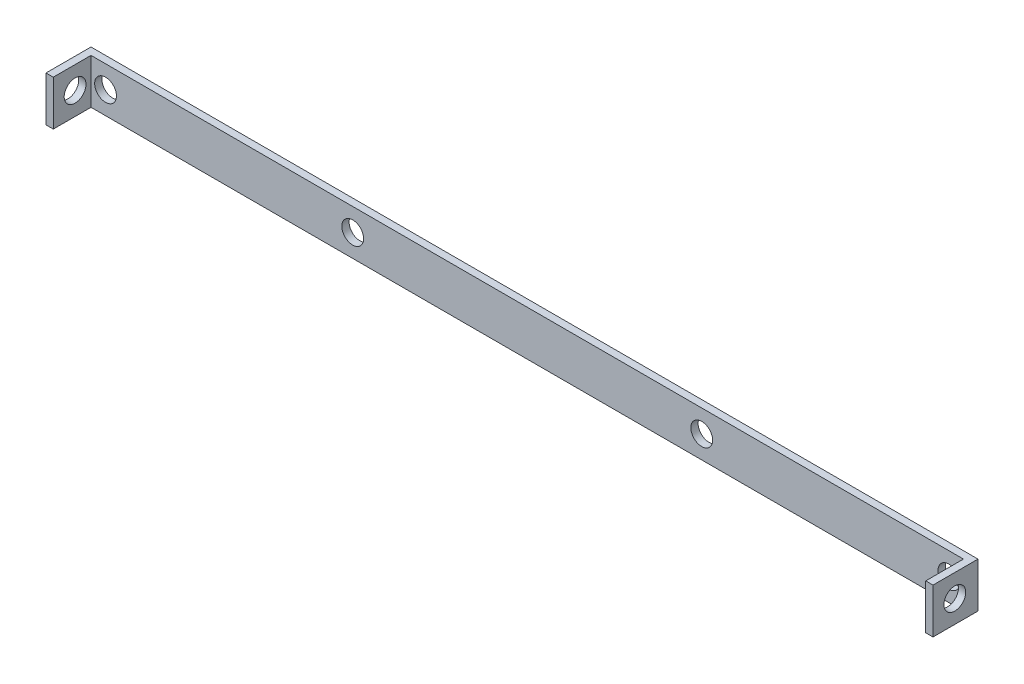
ISO-10303-21;
HEADER;
FILE_DESCRIPTION(('STEP AP214'),'2;1');
FILE_NAME('part.step','',(''),(''),'','','');
FILE_SCHEMA(('AUTOMOTIVE_DESIGN { 1 0 10303 214 1 1 1 1 }'));
ENDSEC;
DATA;
#1=APPLICATION_CONTEXT('core data for automotive mechanical design processes');
#2=APPLICATION_PROTOCOL_DEFINITION('international standard','automotive_design',2000,#1);
#3=PRODUCT_CONTEXT('',#1,'mechanical');
#4=PRODUCT('Part','Part','',(#3));
#5=PRODUCT_RELATED_PRODUCT_CATEGORY('part','',(#4));
#6=PRODUCT_DEFINITION_FORMATION('','',#4);
#7=PRODUCT_DEFINITION_CONTEXT('part definition',#1,'design');
#8=PRODUCT_DEFINITION('design','',#6,#7);
#9=PRODUCT_DEFINITION_SHAPE('','',#8);
#10=(LENGTH_UNIT() NAMED_UNIT(*) SI_UNIT(.MILLI.,.METRE.));
#11=(NAMED_UNIT(*) PLANE_ANGLE_UNIT() SI_UNIT($,.RADIAN.));
#12=(NAMED_UNIT(*) SI_UNIT($,.STERADIAN.) SOLID_ANGLE_UNIT());
#13=UNCERTAINTY_MEASURE_WITH_UNIT(LENGTH_MEASURE(1.E-05),#10,'distance_accuracy_value','');
#14=(GEOMETRIC_REPRESENTATION_CONTEXT(3) GLOBAL_UNCERTAINTY_ASSIGNED_CONTEXT((#13)) GLOBAL_UNIT_ASSIGNED_CONTEXT((#10,
#11,#12)) REPRESENTATION_CONTEXT('',''));
#15=CARTESIAN_POINT('',(0.,0.,0.));
#16=DIRECTION('',(0.,0.,1.));
#17=DIRECTION('',(1.,0.,0.));
#18=AXIS2_PLACEMENT_3D('',#15,#16,#17);
#19=CARTESIAN_POINT('',(0.,0.,4.9125));
#20=DIRECTION('',(0.,0.,-1.));
#21=DIRECTION('',(-1.,0.,0.));
#22=AXIS2_PLACEMENT_3D('',#19,#20,#21);
#23=PLANE('',#22);
#24=DIRECTION('',(0.,1.,0.));
#25=VECTOR('',#24,1.);
#26=CARTESIAN_POINT('',(47.61875,0.,4.9125));
#27=LINE('',#26,#25);
#28=CARTESIAN_POINT('',(47.61875,-2.45625,4.9125));
#29=VERTEX_POINT('',#28);
#30=CARTESIAN_POINT('',(47.61875,2.45625,4.9125));
#31=VERTEX_POINT('',#30);
#32=EDGE_CURVE('E124',#29,#31,#27,.T.);
#33=ORIENTED_EDGE('',*,*,#32,.F.);
#34=DIRECTION('',(1.,0.,0.));
#35=VECTOR('',#34,1.);
#36=CARTESIAN_POINT('',(-48.4125,-2.45625,4.9125));
#37=LINE('',#36,#35);
#38=CARTESIAN_POINT('',(48.4125,-2.45625,4.9125));
#39=VERTEX_POINT('',#38);
#40=EDGE_CURVE('E67',#29,#39,#37,.T.);
#41=ORIENTED_EDGE('',*,*,#40,.T.);
#42=DIRECTION('',(0.,1.,0.));
#43=VECTOR('',#42,1.);
#44=CARTESIAN_POINT('',(48.4125,-2.45625,4.9125));
#45=LINE('',#44,#43);
#46=CARTESIAN_POINT('',(48.4125,2.45625,4.9125));
#47=VERTEX_POINT('',#46);
#48=EDGE_CURVE('E151',#39,#47,#45,.T.);
#49=ORIENTED_EDGE('',*,*,#48,.T.);
#50=DIRECTION('',(-1.,0.,0.));
#51=VECTOR('',#50,1.);
#52=CARTESIAN_POINT('',(-48.4125,2.45625,4.9125));
#53=LINE('',#52,#51);
#54=EDGE_CURVE('E96',#47,#31,#53,.T.);
#55=ORIENTED_EDGE('',*,*,#54,.T.);
#56=EDGE_LOOP('',(#33,#41,#49,#55));
#57=FACE_BOUND('',#56,.T.);
#58=ADVANCED_FACE('F42',(#57),#23,.F.);
#59=DIRECTION('',(0.,-1.,0.));
#60=VECTOR('',#59,1.);
#61=CARTESIAN_POINT('',(-47.61875,0.,4.9125));
#62=LINE('',#61,#60);
#63=CARTESIAN_POINT('',(-47.61875,2.45625,4.9125));
#64=VERTEX_POINT('',#63);
#65=CARTESIAN_POINT('',(-47.61875,-2.45625,4.9125));
#66=VERTEX_POINT('',#65);
#67=EDGE_CURVE('E143',#64,#66,#62,.T.);
#68=ORIENTED_EDGE('',*,*,#67,.F.);
#69=CARTESIAN_POINT('',(-48.4125,2.45625,4.9125));
#70=VERTEX_POINT('',#69);
#71=EDGE_CURVE('E153',#64,#70,#53,.T.);
#72=ORIENTED_EDGE('',*,*,#71,.T.);
#73=DIRECTION('',(0.,-1.,0.));
#74=VECTOR('',#73,1.);
#75=CARTESIAN_POINT('',(-48.4125,-2.45625,4.9125));
#76=LINE('',#75,#74);
#77=CARTESIAN_POINT('',(-48.4125,-2.45625,4.9125));
#78=VERTEX_POINT('',#77);
#79=EDGE_CURVE('E155',#70,#78,#76,.T.);
#80=ORIENTED_EDGE('',*,*,#79,.T.);
#81=EDGE_CURVE('E157',#78,#66,#37,.T.);
#82=ORIENTED_EDGE('',*,*,#81,.T.);
#83=EDGE_LOOP('',(#68,#72,#80,#82));
#84=FACE_BOUND('',#83,.T.);
#85=ADVANCED_FACE('F187',(#84),#23,.F.);
#86=CARTESIAN_POINT('',(48.4125,-2.45625,4.9125));
#87=DIRECTION('',(-1.,0.,0.));
#88=DIRECTION('',(0.,0.,1.));
#89=AXIS2_PLACEMENT_3D('',#86,#87,#88);
#90=PLANE('',#89);
#91=CARTESIAN_POINT('',(48.4125,0.,2.53125));
#92=DIRECTION('',(-1.,0.,0.));
#93=DIRECTION('',(0.,0.,1.));
#94=AXIS2_PLACEMENT_3D('',#91,#92,#93);
#95=CIRCLE('',#94,1.190625);
#96=CARTESIAN_POINT('',(48.4125,0.,3.721875));
#97=VERTEX_POINT('',#96);
#98=EDGE_CURVE('E213',#97,#97,#95,.T.);
#99=ORIENTED_EDGE('',*,*,#98,.T.);
#100=EDGE_LOOP('',(#99));
#101=FACE_BOUND('',#100,.T.);
#102=DIRECTION('',(0.,1.,0.));
#103=VECTOR('',#102,1.);
#104=CARTESIAN_POINT('',(48.4125,-2.45625,0.));
#105=LINE('',#104,#103);
#106=CARTESIAN_POINT('',(48.4125,-2.45625,0.));
#107=VERTEX_POINT('',#106);
#108=CARTESIAN_POINT('',(48.4125,2.45625,0.));
#109=VERTEX_POINT('',#108);
#110=EDGE_CURVE('E126',#107,#109,#105,.T.);
#111=ORIENTED_EDGE('',*,*,#110,.T.);
#112=DIRECTION('',(0.,0.,-1.));
#113=VECTOR('',#112,1.);
#114=CARTESIAN_POINT('',(48.4125,2.45625,4.9125));
#115=LINE('',#114,#113);
#116=EDGE_CURVE('E11',#47,#109,#115,.T.);
#117=ORIENTED_EDGE('',*,*,#116,.F.);
#118=ORIENTED_EDGE('',*,*,#48,.F.);
#119=DIRECTION('',(0.,0.,-1.));
#120=VECTOR('',#119,1.);
#121=CARTESIAN_POINT('',(48.4125,-2.45625,4.9125));
#122=LINE('',#121,#120);
#123=EDGE_CURVE('E160',#39,#107,#122,.T.);
#124=ORIENTED_EDGE('',*,*,#123,.T.);
#125=EDGE_LOOP('',(#111,#117,#118,#124));
#126=FACE_BOUND('',#125,.T.);
#127=ADVANCED_FACE('F44',(#101,#126),#90,.F.);
#128=CARTESIAN_POINT('',(-48.4125,2.45625,4.9125));
#129=DIRECTION('',(0.,-1.,0.));
#130=DIRECTION('',(0.,0.,-1.));
#131=AXIS2_PLACEMENT_3D('',#128,#129,#130);
#132=PLANE('',#131);
#133=ORIENTED_EDGE('',*,*,#71,.F.);
#134=DIRECTION('',(0.,0.,-1.));
#135=VECTOR('',#134,1.);
#136=CARTESIAN_POINT('',(-47.61875,2.45625,4.9125));
#137=LINE('',#136,#135);
#138=CARTESIAN_POINT('',(-47.61875,2.45625,0.79375));
#139=VERTEX_POINT('',#138);
#140=EDGE_CURVE('E58',#64,#139,#137,.T.);
#141=ORIENTED_EDGE('',*,*,#140,.T.);
#142=DIRECTION('',(-1.,0.,0.));
#143=VECTOR('',#142,1.);
#144=CARTESIAN_POINT('',(0.,2.45625,0.79375));
#145=LINE('',#144,#143);
#146=CARTESIAN_POINT('',(47.61875,2.45625,0.79375));
#147=VERTEX_POINT('',#146);
#148=EDGE_CURVE('E130',#147,#139,#145,.T.);
#149=ORIENTED_EDGE('',*,*,#148,.F.);
#150=DIRECTION('',(0.,0.,-1.));
#151=VECTOR('',#150,1.);
#152=CARTESIAN_POINT('',(47.61875,2.45625,4.9125));
#153=LINE('',#152,#151);
#154=EDGE_CURVE('E119',#31,#147,#153,.T.);
#155=ORIENTED_EDGE('',*,*,#154,.F.);
#156=ORIENTED_EDGE('',*,*,#54,.F.);
#157=ORIENTED_EDGE('',*,*,#116,.T.);
#158=DIRECTION('',(-1.,0.,0.));
#159=VECTOR('',#158,1.);
#160=CARTESIAN_POINT('',(-48.4125,2.45625,0.));
#161=LINE('',#160,#159);
#162=CARTESIAN_POINT('',(-48.4125,2.45625,0.));
#163=VERTEX_POINT('',#162);
#164=EDGE_CURVE('E163',#109,#163,#161,.T.);
#165=ORIENTED_EDGE('',*,*,#164,.T.);
#166=DIRECTION('',(0.,0.,-1.));
#167=VECTOR('',#166,1.);
#168=CARTESIAN_POINT('',(-48.4125,2.45625,4.9125));
#169=LINE('',#168,#167);
#170=EDGE_CURVE('E51',#70,#163,#169,.T.);
#171=ORIENTED_EDGE('',*,*,#170,.F.);
#172=EDGE_LOOP('',(#133,#141,#149,#155,#156,#157,#165,#171));
#173=FACE_BOUND('',#172,.T.);
#174=ADVANCED_FACE('F136',(#173),#132,.F.);
#175=CARTESIAN_POINT('',(-48.4125,-2.45625,4.9125));
#176=DIRECTION('',(1.,0.,0.));
#177=DIRECTION('',(0.,0.,-1.));
#178=AXIS2_PLACEMENT_3D('',#175,#176,#177);
#179=PLANE('',#178);
#180=CARTESIAN_POINT('',(-48.4125,0.,2.53125));
#181=DIRECTION('',(-1.,0.,0.));
#182=DIRECTION('',(0.,0.,1.));
#183=AXIS2_PLACEMENT_3D('',#180,#181,#182);
#184=CIRCLE('',#183,1.190625);
#185=CARTESIAN_POINT('',(-48.4125,0.,3.721875));
#186=VERTEX_POINT('',#185);
#187=EDGE_CURVE('E215',#186,#186,#184,.T.);
#188=ORIENTED_EDGE('',*,*,#187,.F.);
#189=EDGE_LOOP('',(#188));
#190=FACE_BOUND('',#189,.T.);
#191=DIRECTION('',(0.,-1.,0.));
#192=VECTOR('',#191,1.);
#193=CARTESIAN_POINT('',(-48.4125,-2.45625,0.));
#194=LINE('',#193,#192);
#195=CARTESIAN_POINT('',(-48.4125,-2.45625,0.));
#196=VERTEX_POINT('',#195);
#197=EDGE_CURVE('E165',#163,#196,#194,.T.);
#198=ORIENTED_EDGE('',*,*,#197,.T.);
#199=DIRECTION('',(0.,0.,-1.));
#200=VECTOR('',#199,1.);
#201=CARTESIAN_POINT('',(-48.4125,-2.45625,4.9125));
#202=LINE('',#201,#200);
#203=EDGE_CURVE('E169',#78,#196,#202,.T.);
#204=ORIENTED_EDGE('',*,*,#203,.F.);
#205=ORIENTED_EDGE('',*,*,#79,.F.);
#206=ORIENTED_EDGE('',*,*,#170,.T.);
#207=EDGE_LOOP('',(#198,#204,#205,#206));
#208=FACE_BOUND('',#207,.T.);
#209=ADVANCED_FACE('F176',(#190,#208),#179,.F.);
#210=CARTESIAN_POINT('',(-48.4125,-2.45625,4.9125));
#211=DIRECTION('',(0.,1.,0.));
#212=DIRECTION('',(0.,0.,1.));
#213=AXIS2_PLACEMENT_3D('',#210,#211,#212);
#214=PLANE('',#213);
#215=ORIENTED_EDGE('',*,*,#40,.F.);
#216=DIRECTION('',(0.,0.,-1.));
#217=VECTOR('',#216,1.);
#218=CARTESIAN_POINT('',(47.61875,-2.45625,4.9125));
#219=LINE('',#218,#217);
#220=CARTESIAN_POINT('',(47.61875,-2.45625,0.79375));
#221=VERTEX_POINT('',#220);
#222=EDGE_CURVE('E145',#29,#221,#219,.T.);
#223=ORIENTED_EDGE('',*,*,#222,.T.);
#224=DIRECTION('',(1.,0.,0.));
#225=VECTOR('',#224,1.);
#226=CARTESIAN_POINT('',(0.,-2.45625,0.79375));
#227=LINE('',#226,#225);
#228=CARTESIAN_POINT('',(-47.61875,-2.45625,0.79375));
#229=VERTEX_POINT('',#228);
#230=EDGE_CURVE('E132',#229,#221,#227,.T.);
#231=ORIENTED_EDGE('',*,*,#230,.F.);
#232=DIRECTION('',(0.,0.,-1.));
#233=VECTOR('',#232,1.);
#234=CARTESIAN_POINT('',(-47.61875,-2.45625,4.9125));
#235=LINE('',#234,#233);
#236=EDGE_CURVE('E142',#66,#229,#235,.T.);
#237=ORIENTED_EDGE('',*,*,#236,.F.);
#238=ORIENTED_EDGE('',*,*,#81,.F.);
#239=ORIENTED_EDGE('',*,*,#203,.T.);
#240=DIRECTION('',(1.,0.,0.));
#241=VECTOR('',#240,1.);
#242=CARTESIAN_POINT('',(-48.4125,-2.45625,0.));
#243=LINE('',#242,#241);
#244=EDGE_CURVE('E89',#196,#107,#243,.T.);
#245=ORIENTED_EDGE('',*,*,#244,.T.);
#246=ORIENTED_EDGE('',*,*,#123,.F.);
#247=EDGE_LOOP('',(#215,#223,#231,#237,#238,#239,#245,#246));
#248=FACE_BOUND('',#247,.T.);
#249=ADVANCED_FACE('F184',(#248),#214,.F.);
#250=CARTESIAN_POINT('',(0.,0.,0.));
#251=DIRECTION('',(0.,0.,-1.));
#252=DIRECTION('',(-1.,0.,0.));
#253=AXIS2_PLACEMENT_3D('',#250,#251,#252);
#254=PLANE('',#253);
#255=CARTESIAN_POINT('',(-46.03125,0.,0.));
#256=DIRECTION('',(0.,0.,1.));
#257=DIRECTION('',(1.,0.,0.));
#258=AXIS2_PLACEMENT_3D('',#255,#256,#257);
#259=CIRCLE('',#258,1.190625);
#260=CARTESIAN_POINT('',(-44.840625,0.,0.));
#261=VERTEX_POINT('',#260);
#262=EDGE_CURVE('E133',#261,#261,#259,.T.);
#263=ORIENTED_EDGE('',*,*,#262,.T.);
#264=EDGE_LOOP('',(#263));
#265=FACE_BOUND('',#264,.T.);
#266=CARTESIAN_POINT('',(-19.05,0.,0.));
#267=DIRECTION('',(0.,0.,1.));
#268=DIRECTION('',(1.,0.,0.));
#269=AXIS2_PLACEMENT_3D('',#266,#267,#268);
#270=CIRCLE('',#269,1.190625);
#271=CARTESIAN_POINT('',(-17.859375,0.,0.));
#272=VERTEX_POINT('',#271);
#273=EDGE_CURVE('E233',#272,#272,#270,.T.);
#274=ORIENTED_EDGE('',*,*,#273,.T.);
#275=EDGE_LOOP('',(#274));
#276=FACE_BOUND('',#275,.T.);
#277=CARTESIAN_POINT('',(19.05,0.,0.));
#278=DIRECTION('',(0.,0.,1.));
#279=DIRECTION('',(1.,0.,0.));
#280=AXIS2_PLACEMENT_3D('',#277,#278,#279);
#281=CIRCLE('',#280,1.190625);
#282=CARTESIAN_POINT('',(20.240625,0.,0.));
#283=VERTEX_POINT('',#282);
#284=EDGE_CURVE('E239',#283,#283,#281,.T.);
#285=ORIENTED_EDGE('',*,*,#284,.T.);
#286=EDGE_LOOP('',(#285));
#287=FACE_BOUND('',#286,.T.);
#288=CARTESIAN_POINT('',(46.03125,0.,0.));
#289=DIRECTION('',(0.,0.,1.));
#290=DIRECTION('',(1.,0.,0.));
#291=AXIS2_PLACEMENT_3D('',#288,#289,#290);
#292=CIRCLE('',#291,1.190625);
#293=CARTESIAN_POINT('',(47.221875,0.,0.));
#294=VERTEX_POINT('',#293);
#295=EDGE_CURVE('E224',#294,#294,#292,.T.);
#296=ORIENTED_EDGE('',*,*,#295,.T.);
#297=EDGE_LOOP('',(#296));
#298=FACE_BOUND('',#297,.T.);
#299=ORIENTED_EDGE('',*,*,#110,.F.);
#300=ORIENTED_EDGE('',*,*,#244,.F.);
#301=ORIENTED_EDGE('',*,*,#197,.F.);
#302=ORIENTED_EDGE('',*,*,#164,.F.);
#303=EDGE_LOOP('',(#299,#300,#301,#302));
#304=FACE_BOUND('',#303,.T.);
#305=ADVANCED_FACE('F180',(#265,#276,#287,#298,#304),#254,.T.);
#306=CARTESIAN_POINT('',(47.61875,-2.45625,4.9125));
#307=DIRECTION('',(-1.,0.,0.));
#308=DIRECTION('',(0.,0.,1.));
#309=AXIS2_PLACEMENT_3D('',#306,#307,#308);
#310=PLANE('',#309);
#311=CARTESIAN_POINT('',(47.61875,0.,2.53125));
#312=DIRECTION('',(-1.,0.,0.));
#313=DIRECTION('',(0.,0.,1.));
#314=AXIS2_PLACEMENT_3D('',#311,#312,#313);
#315=CIRCLE('',#314,1.190625);
#316=CARTESIAN_POINT('',(47.61875,0.,3.721875));
#317=VERTEX_POINT('',#316);
#318=EDGE_CURVE('E218',#317,#317,#315,.T.);
#319=ORIENTED_EDGE('',*,*,#318,.F.);
#320=EDGE_LOOP('',(#319));
#321=FACE_BOUND('',#320,.T.);
#322=DIRECTION('',(0.,1.,0.));
#323=VECTOR('',#322,1.);
#324=CARTESIAN_POINT('',(47.61875,0.,0.79375));
#325=LINE('',#324,#323);
#326=EDGE_CURVE('E122',#221,#147,#325,.T.);
#327=ORIENTED_EDGE('',*,*,#326,.F.);
#328=ORIENTED_EDGE('',*,*,#222,.F.);
#329=ORIENTED_EDGE('',*,*,#32,.T.);
#330=ORIENTED_EDGE('',*,*,#154,.T.);
#331=EDGE_LOOP('',(#327,#328,#329,#330));
#332=FACE_BOUND('',#331,.T.);
#333=ADVANCED_FACE('F121',(#321,#332),#310,.T.);
#334=CARTESIAN_POINT('',(-47.61875,-2.45625,4.9125));
#335=DIRECTION('',(1.,0.,0.));
#336=DIRECTION('',(0.,0.,-1.));
#337=AXIS2_PLACEMENT_3D('',#334,#335,#336);
#338=PLANE('',#337);
#339=CARTESIAN_POINT('',(-47.61875,0.,2.53125));
#340=DIRECTION('',(1.,0.,0.));
#341=DIRECTION('',(0.,0.,-1.));
#342=AXIS2_PLACEMENT_3D('',#339,#340,#341);
#343=CIRCLE('',#342,1.190625);
#344=CARTESIAN_POINT('',(-47.61875,0.,3.721875));
#345=VERTEX_POINT('',#344);
#346=EDGE_CURVE('E46',#345,#345,#343,.T.);
#347=ORIENTED_EDGE('',*,*,#346,.F.);
#348=EDGE_LOOP('',(#347));
#349=FACE_BOUND('',#348,.T.);
#350=DIRECTION('',(0.,-1.,0.));
#351=VECTOR('',#350,1.);
#352=CARTESIAN_POINT('',(-47.61875,0.,0.79375));
#353=LINE('',#352,#351);
#354=EDGE_CURVE('E137',#139,#229,#353,.T.);
#355=ORIENTED_EDGE('',*,*,#354,.F.);
#356=ORIENTED_EDGE('',*,*,#140,.F.);
#357=ORIENTED_EDGE('',*,*,#67,.T.);
#358=ORIENTED_EDGE('',*,*,#236,.T.);
#359=EDGE_LOOP('',(#355,#356,#357,#358));
#360=FACE_BOUND('',#359,.T.);
#361=ADVANCED_FACE('F257',(#349,#360),#338,.T.);
#362=CARTESIAN_POINT('',(0.,0.,0.79375));
#363=DIRECTION('',(0.,0.,-1.));
#364=DIRECTION('',(-1.,0.,0.));
#365=AXIS2_PLACEMENT_3D('',#362,#363,#364);
#366=PLANE('',#365);
#367=CARTESIAN_POINT('',(-46.03125,0.,0.79375));
#368=DIRECTION('',(0.,0.,1.));
#369=DIRECTION('',(1.,0.,0.));
#370=AXIS2_PLACEMENT_3D('',#367,#368,#369);
#371=CIRCLE('',#370,1.190625);
#372=CARTESIAN_POINT('',(-44.840625,0.,0.79375));
#373=VERTEX_POINT('',#372);
#374=EDGE_CURVE('E227',#373,#373,#371,.T.);
#375=ORIENTED_EDGE('',*,*,#374,.F.);
#376=EDGE_LOOP('',(#375));
#377=FACE_BOUND('',#376,.T.);
#378=CARTESIAN_POINT('',(-19.05,0.,0.79375));
#379=DIRECTION('',(0.,0.,1.));
#380=DIRECTION('',(1.,0.,0.));
#381=AXIS2_PLACEMENT_3D('',#378,#379,#380);
#382=CIRCLE('',#381,1.190625);
#383=CARTESIAN_POINT('',(-17.859375,0.,0.79375));
#384=VERTEX_POINT('',#383);
#385=EDGE_CURVE('E230',#384,#384,#382,.T.);
#386=ORIENTED_EDGE('',*,*,#385,.F.);
#387=EDGE_LOOP('',(#386));
#388=FACE_BOUND('',#387,.T.);
#389=CARTESIAN_POINT('',(19.05,0.,0.79375));
#390=DIRECTION('',(0.,0.,1.));
#391=DIRECTION('',(1.,0.,0.));
#392=AXIS2_PLACEMENT_3D('',#389,#390,#391);
#393=CIRCLE('',#392,1.190625);
#394=CARTESIAN_POINT('',(20.240625,0.,0.79375));
#395=VERTEX_POINT('',#394);
#396=EDGE_CURVE('E236',#395,#395,#393,.T.);
#397=ORIENTED_EDGE('',*,*,#396,.F.);
#398=EDGE_LOOP('',(#397));
#399=FACE_BOUND('',#398,.T.);
#400=CARTESIAN_POINT('',(46.03125,0.,0.79375));
#401=DIRECTION('',(0.,0.,1.));
#402=DIRECTION('',(1.,0.,0.));
#403=AXIS2_PLACEMENT_3D('',#400,#401,#402);
#404=CIRCLE('',#403,1.190625);
#405=CARTESIAN_POINT('',(47.221875,0.,0.79375));
#406=VERTEX_POINT('',#405);
#407=EDGE_CURVE('E242',#406,#406,#404,.T.);
#408=ORIENTED_EDGE('',*,*,#407,.F.);
#409=EDGE_LOOP('',(#408));
#410=FACE_BOUND('',#409,.T.);
#411=ORIENTED_EDGE('',*,*,#326,.T.);
#412=ORIENTED_EDGE('',*,*,#148,.T.);
#413=ORIENTED_EDGE('',*,*,#354,.T.);
#414=ORIENTED_EDGE('',*,*,#230,.T.);
#415=EDGE_LOOP('',(#411,#412,#413,#414));
#416=FACE_BOUND('',#415,.T.);
#417=ADVANCED_FACE('F129',(#377,#388,#399,#410,#416),#366,.F.);
#418=CARTESIAN_POINT('',(46.03125,0.,0.));
#419=DIRECTION('',(0.,0.,1.));
#420=DIRECTION('',(1.,0.,0.));
#421=AXIS2_PLACEMENT_3D('',#418,#419,#420);
#422=CYLINDRICAL_SURFACE('',#421,1.190625);
#423=ORIENTED_EDGE('',*,*,#295,.F.);
#424=EDGE_LOOP('',(#423));
#425=FACE_BOUND('',#424,.T.);
#426=ORIENTED_EDGE('',*,*,#407,.T.);
#427=EDGE_LOOP('',(#426));
#428=FACE_BOUND('',#427,.T.);
#429=ADVANCED_FACE('F249',(#425,#428),#422,.F.);
#430=CARTESIAN_POINT('',(19.05,0.,0.));
#431=DIRECTION('',(0.,0.,1.));
#432=DIRECTION('',(1.,0.,0.));
#433=AXIS2_PLACEMENT_3D('',#430,#431,#432);
#434=CYLINDRICAL_SURFACE('',#433,1.190625);
#435=ORIENTED_EDGE('',*,*,#284,.F.);
#436=EDGE_LOOP('',(#435));
#437=FACE_BOUND('',#436,.T.);
#438=ORIENTED_EDGE('',*,*,#396,.T.);
#439=EDGE_LOOP('',(#438));
#440=FACE_BOUND('',#439,.T.);
#441=ADVANCED_FACE('F252',(#437,#440),#434,.F.);
#442=CARTESIAN_POINT('',(-19.05,0.,0.));
#443=DIRECTION('',(0.,0.,1.));
#444=DIRECTION('',(1.,0.,0.));
#445=AXIS2_PLACEMENT_3D('',#442,#443,#444);
#446=CYLINDRICAL_SURFACE('',#445,1.190625);
#447=ORIENTED_EDGE('',*,*,#273,.F.);
#448=EDGE_LOOP('',(#447));
#449=FACE_BOUND('',#448,.T.);
#450=ORIENTED_EDGE('',*,*,#385,.T.);
#451=EDGE_LOOP('',(#450));
#452=FACE_BOUND('',#451,.T.);
#453=ADVANCED_FACE('F270',(#449,#452),#446,.F.);
#454=CARTESIAN_POINT('',(-46.03125,0.,0.));
#455=DIRECTION('',(0.,0.,1.));
#456=DIRECTION('',(1.,0.,0.));
#457=AXIS2_PLACEMENT_3D('',#454,#455,#456);
#458=CYLINDRICAL_SURFACE('',#457,1.190625);
#459=ORIENTED_EDGE('',*,*,#262,.F.);
#460=EDGE_LOOP('',(#459));
#461=FACE_BOUND('',#460,.T.);
#462=ORIENTED_EDGE('',*,*,#374,.T.);
#463=EDGE_LOOP('',(#462));
#464=FACE_BOUND('',#463,.T.);
#465=ADVANCED_FACE('F276',(#461,#464),#458,.F.);
#466=CARTESIAN_POINT('',(48.4125,0.,2.53125));
#467=DIRECTION('',(-1.,0.,0.));
#468=DIRECTION('',(0.,0.,1.));
#469=AXIS2_PLACEMENT_3D('',#466,#467,#468);
#470=CYLINDRICAL_SURFACE('',#469,1.190625);
#471=CARTESIAN_POINT('',(-47.61875,0.,3.721875));
#472=CARTESIAN_POINT('',(-47.6270182291667,0.,3.721875));
#473=CARTESIAN_POINT('',(-47.6352864583333,0.,3.721875));
#474=CARTESIAN_POINT('',(-47.6518229166667,0.,3.721875));
#475=CARTESIAN_POINT('',(-47.6600911458333,0.,3.721875));
#476=CARTESIAN_POINT('',(-47.6766276041667,0.,3.721875));
#477=CARTESIAN_POINT('',(-47.6848958333333,0.,3.721875));
#478=CARTESIAN_POINT('',(-47.7014322916666,0.,3.721875));
#479=CARTESIAN_POINT('',(-47.7097005208333,0.,3.721875));
#480=CARTESIAN_POINT('',(-47.7262369791667,0.,3.721875));
#481=CARTESIAN_POINT('',(-47.7345052083333,0.,3.721875));
#482=CARTESIAN_POINT('',(-47.7510416666667,0.,3.721875));
#483=CARTESIAN_POINT('',(-47.7593098958333,0.,3.721875));
#484=CARTESIAN_POINT('',(-47.7758463541667,0.,3.721875));
#485=CARTESIAN_POINT('',(-47.7841145833333,0.,3.721875));
#486=CARTESIAN_POINT('',(-47.8006510416666,0.,3.721875));
#487=CARTESIAN_POINT('',(-47.8089192708333,0.,3.721875));
#488=CARTESIAN_POINT('',(-47.8254557291667,0.,3.721875));
#489=CARTESIAN_POINT('',(-47.8337239583333,0.,3.721875));
#490=CARTESIAN_POINT('',(-47.8502604166667,0.,3.721875));
#491=CARTESIAN_POINT('',(-47.8585286458333,0.,3.721875));
#492=CARTESIAN_POINT('',(-47.8750651041667,0.,3.721875));
#493=CARTESIAN_POINT('',(-47.8833333333333,0.,3.721875));
#494=CARTESIAN_POINT('',(-47.8998697916667,0.,3.721875));
#495=CARTESIAN_POINT('',(-47.9081380208333,0.,3.721875));
#496=CARTESIAN_POINT('',(-47.9246744791667,0.,3.721875));
#497=CARTESIAN_POINT('',(-47.9329427083333,0.,3.721875));
#498=CARTESIAN_POINT('',(-47.9494791666666,0.,3.721875));
#499=CARTESIAN_POINT('',(-47.9577473958333,0.,3.721875));
#500=CARTESIAN_POINT('',(-47.9742838541667,0.,3.721875));
#501=CARTESIAN_POINT('',(-47.9825520833333,0.,3.721875));
#502=CARTESIAN_POINT('',(-47.9990885416666,0.,3.721875));
#503=CARTESIAN_POINT('',(-48.0073567708333,0.,3.721875));
#504=CARTESIAN_POINT('',(-48.0238932291666,0.,3.721875));
#505=CARTESIAN_POINT('',(-48.0321614583333,0.,3.721875));
#506=CARTESIAN_POINT('',(-48.0486979166666,0.,3.721875));
#507=CARTESIAN_POINT('',(-48.0569661458333,0.,3.721875));
#508=CARTESIAN_POINT('',(-48.0735026041666,0.,3.721875));
#509=CARTESIAN_POINT('',(-48.0817708333333,0.,3.721875));
#510=CARTESIAN_POINT('',(-48.0983072916666,0.,3.721875));
#511=CARTESIAN_POINT('',(-48.1065755208333,0.,3.721875));
#512=CARTESIAN_POINT('',(-48.1231119791666,0.,3.721875));
#513=CARTESIAN_POINT('',(-48.1313802083333,0.,3.721875));
#514=CARTESIAN_POINT('',(-48.1479166666666,0.,3.721875));
#515=CARTESIAN_POINT('',(-48.1561848958333,0.,3.721875));
#516=CARTESIAN_POINT('',(-48.1727213541666,0.,3.721875));
#517=CARTESIAN_POINT('',(-48.1809895833333,0.,3.721875));
#518=CARTESIAN_POINT('',(-48.1975260416666,0.,3.721875));
#519=CARTESIAN_POINT('',(-48.2057942708333,0.,3.721875));
#520=CARTESIAN_POINT('',(-48.2223307291666,0.,3.721875));
#521=CARTESIAN_POINT('',(-48.2305989583333,0.,3.721875));
#522=CARTESIAN_POINT('',(-48.2471354166666,0.,3.721875));
#523=CARTESIAN_POINT('',(-48.2554036458333,0.,3.721875));
#524=CARTESIAN_POINT('',(-48.2719401041666,0.,3.721875));
#525=CARTESIAN_POINT('',(-48.2802083333333,0.,3.721875));
#526=CARTESIAN_POINT('',(-48.2967447916666,0.,3.721875));
#527=CARTESIAN_POINT('',(-48.3050130208333,0.,3.721875));
#528=CARTESIAN_POINT('',(-48.3215494791666,0.,3.721875));
#529=CARTESIAN_POINT('',(-48.3298177083333,0.,3.721875));
#530=CARTESIAN_POINT('',(-48.3463541666666,0.,3.721875));
#531=CARTESIAN_POINT('',(-48.3546223958333,0.,3.721875));
#532=CARTESIAN_POINT('',(-48.3711588541666,0.,3.721875));
#533=CARTESIAN_POINT('',(-48.3794270833333,0.,3.721875));
#534=CARTESIAN_POINT('',(-48.3959635416666,0.,3.721875));
#535=CARTESIAN_POINT('',(-48.4042317708333,0.,3.721875));
#536=CARTESIAN_POINT('',(-48.4125,0.,3.721875));
#537=B_SPLINE_CURVE_WITH_KNOTS('',3,(#471,#472,#473,#474,#475,#476,#477,#478,#479,#480,#481,
#482,#483,#484,#485,#486,#487,#488,#489,#490,#491,#492,#493,#494,#495,#496,#497,#498,#499,#500,
#501,#502,#503,#504,#505,#506,#507,#508,#509,#510,#511,#512,#513,#514,#515,#516,#517,#518,#519,
#520,#521,#522,#523,#524,#525,#526,#527,#528,#529,#530,#531,#532,#533,#534,#535,#536),
.UNSPECIFIED.,.F.,.F.,(4,2,2,2,2,2,2,2,2,2,2,2,2,2,2,2,2,2,2,2,2,2,2,2,2,2,2,2,2,2,2,2,4),(0.,
0.0248046875000046,0.0496093749999954,0.0744140625,0.0992187499999908,0.124023437499995,
0.148828125,0.173632812499991,0.198437499999995,0.2232421875,0.248046874999991,
0.272851562499996,0.29765625,0.322460937499991,0.347265624999996,0.372070312499986,
0.396874999999991,0.421679687499996,0.446484374999986,0.471289062499991,0.496093749999982,
0.520898437499986,0.545703124999991,0.570507812499982,0.595312499999986,0.620117187499991,
0.644921874999982,0.669726562499987,0.694531249999991,0.719335937499982,0.744140624999987,
0.768945312499977,0.793749999999982),.UNSPECIFIED.);
#538=EDGE_CURVE('BSEAM290',#345,#186,#537,.T.);
#539=ORIENTED_EDGE('',*,*,#346,.T.);
#540=ORIENTED_EDGE('',*,*,#187,.T.);
#541=ORIENTED_EDGE('',*,*,#538,.T.);
#542=ORIENTED_EDGE('',*,*,#538,.F.);
#543=EDGE_LOOP('',(#539,#541,#540,#542));
#544=FACE_BOUND('',#543,.T.);
#545=ADVANCED_FACE('F290',(#544),#470,.F.);
#546=CARTESIAN_POINT('',(47.61875,0.,3.721875));
#547=CARTESIAN_POINT('',(47.6270182291667,0.,3.721875));
#548=CARTESIAN_POINT('',(47.6352864583333,0.,3.721875));
#549=CARTESIAN_POINT('',(47.6518229166667,0.,3.721875));
#550=CARTESIAN_POINT('',(47.6600911458333,0.,3.721875));
#551=CARTESIAN_POINT('',(47.6766276041667,0.,3.721875));
#552=CARTESIAN_POINT('',(47.6848958333333,0.,3.721875));
#553=CARTESIAN_POINT('',(47.7014322916667,0.,3.721875));
#554=CARTESIAN_POINT('',(47.7097005208334,0.,3.721875));
#555=CARTESIAN_POINT('',(47.7262369791667,0.,3.721875));
#556=CARTESIAN_POINT('',(47.7345052083333,0.,3.721875));
#557=CARTESIAN_POINT('',(47.7510416666667,0.,3.721875));
#558=CARTESIAN_POINT('',(47.7593098958333,0.,3.721875));
#559=CARTESIAN_POINT('',(47.7758463541667,0.,3.721875));
#560=CARTESIAN_POINT('',(47.7841145833333,0.,3.721875));
#561=CARTESIAN_POINT('',(47.8006510416667,0.,3.721875));
#562=CARTESIAN_POINT('',(47.8089192708333,0.,3.721875));
#563=CARTESIAN_POINT('',(47.8254557291667,0.,3.721875));
#564=CARTESIAN_POINT('',(47.8337239583333,0.,3.721875));
#565=CARTESIAN_POINT('',(47.8502604166667,0.,3.721875));
#566=CARTESIAN_POINT('',(47.8585286458334,0.,3.721875));
#567=CARTESIAN_POINT('',(47.8750651041667,0.,3.721875));
#568=CARTESIAN_POINT('',(47.8833333333333,0.,3.721875));
#569=CARTESIAN_POINT('',(47.8998697916667,0.,3.721875));
#570=CARTESIAN_POINT('',(47.9081380208333,0.,3.721875));
#571=CARTESIAN_POINT('',(47.9246744791667,0.,3.721875));
#572=CARTESIAN_POINT('',(47.9329427083333,0.,3.721875));
#573=CARTESIAN_POINT('',(47.9494791666667,0.,3.721875));
#574=CARTESIAN_POINT('',(47.9577473958333,0.,3.721875));
#575=CARTESIAN_POINT('',(47.9742838541667,0.,3.721875));
#576=CARTESIAN_POINT('',(47.9825520833333,0.,3.721875));
#577=CARTESIAN_POINT('',(47.9990885416667,0.,3.721875));
#578=CARTESIAN_POINT('',(48.0073567708333,0.,3.721875));
#579=CARTESIAN_POINT('',(48.0238932291667,0.,3.721875));
#580=CARTESIAN_POINT('',(48.0321614583333,0.,3.721875));
#581=CARTESIAN_POINT('',(48.0486979166667,0.,3.721875));
#582=CARTESIAN_POINT('',(48.0569661458333,0.,3.721875));
#583=CARTESIAN_POINT('',(48.0735026041667,0.,3.721875));
#584=CARTESIAN_POINT('',(48.0817708333334,0.,3.721875));
#585=CARTESIAN_POINT('',(48.0983072916667,0.,3.721875));
#586=CARTESIAN_POINT('',(48.1065755208333,0.,3.721875));
#587=CARTESIAN_POINT('',(48.1231119791667,0.,3.721875));
#588=CARTESIAN_POINT('',(48.1313802083333,0.,3.721875));
#589=CARTESIAN_POINT('',(48.1479166666667,0.,3.721875));
#590=CARTESIAN_POINT('',(48.1561848958333,0.,3.721875));
#591=CARTESIAN_POINT('',(48.1727213541667,0.,3.721875));
#592=CARTESIAN_POINT('',(48.1809895833333,0.,3.721875));
#593=CARTESIAN_POINT('',(48.1975260416667,0.,3.721875));
#594=CARTESIAN_POINT('',(48.2057942708333,0.,3.721875));
#595=CARTESIAN_POINT('',(48.2223307291667,0.,3.721875));
#596=CARTESIAN_POINT('',(48.2305989583334,0.,3.721875));
#597=CARTESIAN_POINT('',(48.2471354166667,0.,3.721875));
#598=CARTESIAN_POINT('',(48.2554036458333,0.,3.721875));
#599=CARTESIAN_POINT('',(48.2719401041667,0.,3.721875));
#600=CARTESIAN_POINT('',(48.2802083333333,0.,3.721875));
#601=CARTESIAN_POINT('',(48.2967447916667,0.,3.721875));
#602=CARTESIAN_POINT('',(48.3050130208333,0.,3.721875));
#603=CARTESIAN_POINT('',(48.3215494791667,0.,3.721875));
#604=CARTESIAN_POINT('',(48.3298177083333,0.,3.721875));
#605=CARTESIAN_POINT('',(48.3463541666667,0.,3.721875));
#606=CARTESIAN_POINT('',(48.3546223958333,0.,3.721875));
#607=CARTESIAN_POINT('',(48.3711588541667,0.,3.721875));
#608=CARTESIAN_POINT('',(48.3794270833333,0.,3.721875));
#609=CARTESIAN_POINT('',(48.3959635416667,0.,3.721875));
#610=CARTESIAN_POINT('',(48.4042317708333,0.,3.721875));
#611=CARTESIAN_POINT('',(48.4125,0.,3.721875));
#612=B_SPLINE_CURVE_WITH_KNOTS('',3,(#546,#547,#548,#549,#550,#551,#552,#553,#554,#555,#556,
#557,#558,#559,#560,#561,#562,#563,#564,#565,#566,#567,#568,#569,#570,#571,#572,#573,#574,#575,
#576,#577,#578,#579,#580,#581,#582,#583,#584,#585,#586,#587,#588,#589,#590,#591,#592,#593,#594,
#595,#596,#597,#598,#599,#600,#601,#602,#603,#604,#605,#606,#607,#608,#609,#610,#611),
.UNSPECIFIED.,.F.,.F.,(4,2,2,2,2,2,2,2,2,2,2,2,2,2,2,2,2,2,2,2,2,2,2,2,2,2,2,2,2,2,2,2,4),(0.,
0.0248046875000046,0.0496093750000023,0.074414062500007,0.0992187500000047,0.124023437500002,
0.148828125000007,0.173632812500005,0.198437500000002,0.223242187500007,0.248046875000005,
0.272851562500002,0.297656250000007,0.322460937500005,0.347265625000003,0.372070312500007,
0.396875000000005,0.421679687500003,0.446484375000007,0.471289062500005,0.496093750000003,
0.520898437500007,0.545703125000005,0.570507812500003,0.595312500000007,0.620117187500005,
0.644921875000003,0.669726562500007,0.694531250000005,0.719335937500003,0.744140625000007,
0.768945312500005,0.793750000000003),.UNSPECIFIED.);
#613=EDGE_CURVE('BSEAM288',#317,#97,#612,.T.);
#614=ORIENTED_EDGE('',*,*,#318,.T.);
#615=ORIENTED_EDGE('',*,*,#98,.F.);
#616=ORIENTED_EDGE('',*,*,#613,.T.);
#617=ORIENTED_EDGE('',*,*,#613,.F.);
#618=EDGE_LOOP('',(#614,#616,#615,#617));
#619=FACE_BOUND('',#618,.T.);
#620=ADVANCED_FACE('F288',(#619),#470,.F.);
#621=CLOSED_SHELL('',(#58,#85,#127,#174,#209,#249,#305,#333,#361,#417,#429,#441,#453,#465,#545,#620));
#622=MANIFOLD_SOLID_BREP('B2',#621);
#623=ADVANCED_BREP_SHAPE_REPRESENTATION('',(#18,#622),#14);
#624=SHAPE_DEFINITION_REPRESENTATION(#9,#623);
ENDSEC;
END-ISO-10303-21;
